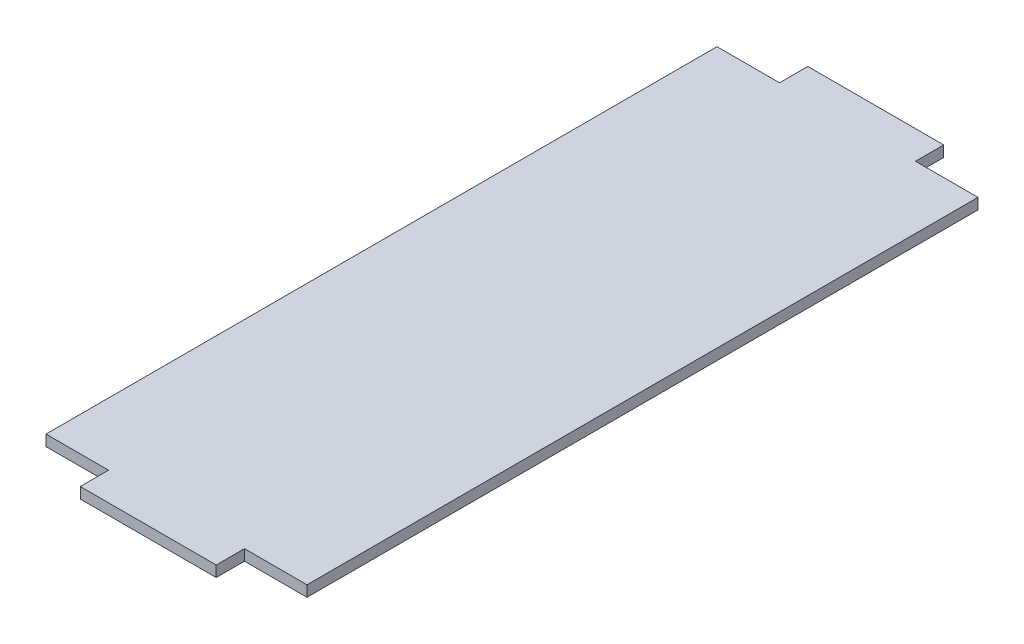
ISO-10303-21;
HEADER;
FILE_DESCRIPTION(('STEP AP214'),'2;1');
FILE_NAME('part.step','',(''),(''),'','','');
FILE_SCHEMA(('AUTOMOTIVE_DESIGN { 1 0 10303 214 1 1 1 1 }'));
ENDSEC;
DATA;
#1=APPLICATION_CONTEXT('core data for automotive mechanical design processes');
#2=APPLICATION_PROTOCOL_DEFINITION('international standard','automotive_design',2000,#1);
#3=PRODUCT_CONTEXT('',#1,'mechanical');
#4=PRODUCT('Part','Part','',(#3));
#5=PRODUCT_RELATED_PRODUCT_CATEGORY('part','',(#4));
#6=PRODUCT_DEFINITION_FORMATION('','',#4);
#7=PRODUCT_DEFINITION_CONTEXT('part definition',#1,'design');
#8=PRODUCT_DEFINITION('design','',#6,#7);
#9=PRODUCT_DEFINITION_SHAPE('','',#8);
#10=(LENGTH_UNIT() NAMED_UNIT(*) SI_UNIT(.MILLI.,.METRE.));
#11=(NAMED_UNIT(*) PLANE_ANGLE_UNIT() SI_UNIT($,.RADIAN.));
#12=(NAMED_UNIT(*) SI_UNIT($,.STERADIAN.) SOLID_ANGLE_UNIT());
#13=UNCERTAINTY_MEASURE_WITH_UNIT(LENGTH_MEASURE(1.E-05),#10,'distance_accuracy_value','');
#14=(GEOMETRIC_REPRESENTATION_CONTEXT(3) GLOBAL_UNCERTAINTY_ASSIGNED_CONTEXT((#13)) GLOBAL_UNIT_ASSIGNED_CONTEXT((#10,
#11,#12)) REPRESENTATION_CONTEXT('',''));
#15=CARTESIAN_POINT('',(0.,0.,0.));
#16=DIRECTION('',(0.,0.,1.));
#17=DIRECTION('',(1.,0.,0.));
#18=AXIS2_PLACEMENT_3D('',#15,#16,#17);
#19=CARTESIAN_POINT('',(0.,0.,0.));
#20=DIRECTION('',(0.,1.,0.));
#21=DIRECTION('',(0.,0.,1.));
#22=AXIS2_PLACEMENT_3D('',#19,#20,#21);
#23=PLANE('',#22);
#24=DIRECTION('',(0.,0.,-1.));
#25=VECTOR('',#24,1.);
#26=CARTESIAN_POINT('',(0.625,0.,3.215));
#27=LINE('',#26,#25);
#28=CARTESIAN_POINT('',(0.625,0.,3.345));
#29=VERTEX_POINT('',#28);
#30=CARTESIAN_POINT('',(0.625,0.,3.085));
#31=VERTEX_POINT('',#30);
#32=EDGE_CURVE('E119',#29,#31,#27,.T.);
#33=ORIENTED_EDGE('',*,*,#32,.F.);
#34=DIRECTION('',(1.,0.,0.));
#35=VECTOR('',#34,1.);
#36=CARTESIAN_POINT('',(0.,0.,3.345));
#37=LINE('',#36,#35);
#38=CARTESIAN_POINT('',(-0.625,0.,3.345));
#39=VERTEX_POINT('',#38);
#40=EDGE_CURVE('E118',#39,#29,#37,.T.);
#41=ORIENTED_EDGE('',*,*,#40,.F.);
#42=DIRECTION('',(0.,0.,1.));
#43=VECTOR('',#42,1.);
#44=CARTESIAN_POINT('',(-0.625,0.,0.));
#45=LINE('',#44,#43);
#46=CARTESIAN_POINT('',(-0.625,0.,3.085));
#47=VERTEX_POINT('',#46);
#48=EDGE_CURVE('E101',#47,#39,#45,.T.);
#49=ORIENTED_EDGE('',*,*,#48,.F.);
#50=DIRECTION('',(1.,0.,0.));
#51=VECTOR('',#50,1.);
#52=CARTESIAN_POINT('',(0.,0.,3.085));
#53=LINE('',#52,#51);
#54=CARTESIAN_POINT('',(-1.2,0.,3.085));
#55=VERTEX_POINT('',#54);
#56=EDGE_CURVE('E19',#55,#47,#53,.T.);
#57=ORIENTED_EDGE('',*,*,#56,.F.);
#58=DIRECTION('',(0.,0.,1.));
#59=VECTOR('',#58,1.);
#60=CARTESIAN_POINT('',(-1.2,0.,-1.5425));
#61=LINE('',#60,#59);
#62=CARTESIAN_POINT('',(-1.2,0.,-3.085));
#63=VERTEX_POINT('',#62);
#64=EDGE_CURVE('E166',#63,#55,#61,.T.);
#65=ORIENTED_EDGE('',*,*,#64,.F.);
#66=DIRECTION('',(-1.,0.,0.));
#67=VECTOR('',#66,1.);
#68=CARTESIAN_POINT('',(-0.9125,0.,-3.085));
#69=LINE('',#68,#67);
#70=CARTESIAN_POINT('',(-0.625,0.,-3.085));
#71=VERTEX_POINT('',#70);
#72=EDGE_CURVE('E160',#71,#63,#69,.T.);
#73=ORIENTED_EDGE('',*,*,#72,.F.);
#74=DIRECTION('',(0.,0.,1.));
#75=VECTOR('',#74,1.);
#76=CARTESIAN_POINT('',(-0.625,0.,-3.215));
#77=LINE('',#76,#75);
#78=CARTESIAN_POINT('',(-0.625,0.,-3.345));
#79=VERTEX_POINT('',#78);
#80=EDGE_CURVE('E154',#79,#71,#77,.T.);
#81=ORIENTED_EDGE('',*,*,#80,.F.);
#82=DIRECTION('',(-1.,0.,0.));
#83=VECTOR('',#82,1.);
#84=CARTESIAN_POINT('',(0.3125,0.,-3.345));
#85=LINE('',#84,#83);
#86=CARTESIAN_POINT('',(0.625,0.,-3.345));
#87=VERTEX_POINT('',#86);
#88=EDGE_CURVE('E148',#87,#79,#85,.T.);
#89=ORIENTED_EDGE('',*,*,#88,.F.);
#90=DIRECTION('',(0.,0.,-1.));
#91=VECTOR('',#90,1.);
#92=CARTESIAN_POINT('',(0.625,0.,-3.215));
#93=LINE('',#92,#91);
#94=CARTESIAN_POINT('',(0.625,0.,-3.085));
#95=VERTEX_POINT('',#94);
#96=EDGE_CURVE('E142',#95,#87,#93,.T.);
#97=ORIENTED_EDGE('',*,*,#96,.F.);
#98=DIRECTION('',(-1.,0.,0.));
#99=VECTOR('',#98,1.);
#100=CARTESIAN_POINT('',(0.9125,0.,-3.085));
#101=LINE('',#100,#99);
#102=CARTESIAN_POINT('',(1.2,0.,-3.085));
#103=VERTEX_POINT('',#102);
#104=EDGE_CURVE('E136',#103,#95,#101,.T.);
#105=ORIENTED_EDGE('',*,*,#104,.F.);
#106=DIRECTION('',(0.,0.,-1.));
#107=VECTOR('',#106,1.);
#108=CARTESIAN_POINT('',(1.2,0.,1.5425));
#109=LINE('',#108,#107);
#110=CARTESIAN_POINT('',(1.2,0.,3.085));
#111=VERTEX_POINT('',#110);
#112=EDGE_CURVE('E130',#111,#103,#109,.T.);
#113=ORIENTED_EDGE('',*,*,#112,.F.);
#114=DIRECTION('',(1.,0.,0.));
#115=VECTOR('',#114,1.);
#116=CARTESIAN_POINT('',(0.9125,0.,3.085));
#117=LINE('',#116,#115);
#118=EDGE_CURVE('E124',#31,#111,#117,.T.);
#119=ORIENTED_EDGE('',*,*,#118,.F.);
#120=EDGE_LOOP('',(#33,#41,#49,#57,#65,#73,#81,#89,#97,#105,#113,#119));
#121=FACE_BOUND('',#120,.T.);
#122=ADVANCED_FACE('F16',(#121),#23,.F.);
#123=CARTESIAN_POINT('',(0.625,0.,3.215));
#124=DIRECTION('',(1.,0.,0.));
#125=DIRECTION('',(0.,0.,-1.));
#126=AXIS2_PLACEMENT_3D('',#123,#124,#125);
#127=PLANE('',#126);
#128=DIRECTION('',(0.,0.,1.));
#129=VECTOR('',#128,1.);
#130=CARTESIAN_POINT('',(0.625,0.1,0.));
#131=LINE('',#130,#129);
#132=CARTESIAN_POINT('',(0.625,0.1,3.345));
#133=VERTEX_POINT('',#132);
#134=CARTESIAN_POINT('',(0.625,0.1,3.085));
#135=VERTEX_POINT('',#134);
#136=EDGE_CURVE('E175',#133,#135,#131,.F.);
#137=ORIENTED_EDGE('',*,*,#136,.F.);
#138=DIRECTION('',(0.,1.,0.));
#139=VECTOR('',#138,1.);
#140=CARTESIAN_POINT('',(0.625,0.,3.345));
#141=LINE('',#140,#139);
#142=EDGE_CURVE('E114',#29,#133,#141,.T.);
#143=ORIENTED_EDGE('',*,*,#142,.F.);
#144=ORIENTED_EDGE('',*,*,#32,.T.);
#145=DIRECTION('',(0.,1.,0.));
#146=VECTOR('',#145,1.);
#147=CARTESIAN_POINT('',(0.625,0.,3.085));
#148=LINE('',#147,#146);
#149=EDGE_CURVE('E127',#135,#31,#148,.F.);
#150=ORIENTED_EDGE('',*,*,#149,.F.);
#151=EDGE_LOOP('',(#137,#143,#144,#150));
#152=FACE_BOUND('',#151,.T.);
#153=ADVANCED_FACE('F231',(#152),#127,.T.);
#154=CARTESIAN_POINT('',(0.9125,0.,3.085));
#155=DIRECTION('',(0.,0.,1.));
#156=DIRECTION('',(1.,0.,0.));
#157=AXIS2_PLACEMENT_3D('',#154,#155,#156);
#158=PLANE('',#157);
#159=DIRECTION('',(1.,0.,0.));
#160=VECTOR('',#159,1.);
#161=CARTESIAN_POINT('',(0.,0.1,3.085));
#162=LINE('',#161,#160);
#163=CARTESIAN_POINT('',(1.2,0.1,3.085));
#164=VERTEX_POINT('',#163);
#165=EDGE_CURVE('E178',#135,#164,#162,.T.);
#166=ORIENTED_EDGE('',*,*,#165,.F.);
#167=ORIENTED_EDGE('',*,*,#149,.T.);
#168=ORIENTED_EDGE('',*,*,#118,.T.);
#169=DIRECTION('',(0.,1.,0.));
#170=VECTOR('',#169,1.);
#171=CARTESIAN_POINT('',(1.19999999999999,0.,3.085));
#172=LINE('',#171,#170);
#173=EDGE_CURVE('E133',#164,#111,#172,.F.);
#174=ORIENTED_EDGE('',*,*,#173,.F.);
#175=EDGE_LOOP('',(#166,#167,#168,#174));
#176=FACE_BOUND('',#175,.T.);
#177=ADVANCED_FACE('F229',(#176),#158,.T.);
#178=CARTESIAN_POINT('',(1.2,0.,1.5425));
#179=DIRECTION('',(1.,0.,0.));
#180=DIRECTION('',(0.,0.,-1.));
#181=AXIS2_PLACEMENT_3D('',#178,#179,#180);
#182=PLANE('',#181);
#183=DIRECTION('',(0.,0.,1.));
#184=VECTOR('',#183,1.);
#185=CARTESIAN_POINT('',(1.2,0.1,0.));
#186=LINE('',#185,#184);
#187=CARTESIAN_POINT('',(1.20000000000001,0.1,-3.085));
#188=VERTEX_POINT('',#187);
#189=EDGE_CURVE('E181',#164,#188,#186,.F.);
#190=ORIENTED_EDGE('',*,*,#189,.F.);
#191=ORIENTED_EDGE('',*,*,#173,.T.);
#192=ORIENTED_EDGE('',*,*,#112,.T.);
#193=DIRECTION('',(0.,1.,0.));
#194=VECTOR('',#193,1.);
#195=CARTESIAN_POINT('',(1.2,0.,-3.085));
#196=LINE('',#195,#194);
#197=EDGE_CURVE('E139',#188,#103,#196,.F.);
#198=ORIENTED_EDGE('',*,*,#197,.F.);
#199=EDGE_LOOP('',(#190,#191,#192,#198));
#200=FACE_BOUND('',#199,.T.);
#201=ADVANCED_FACE('F226',(#200),#182,.T.);
#202=CARTESIAN_POINT('',(0.9125,0.,-3.085));
#203=DIRECTION('',(0.,0.,-1.));
#204=DIRECTION('',(-1.,0.,0.));
#205=AXIS2_PLACEMENT_3D('',#202,#203,#204);
#206=PLANE('',#205);
#207=DIRECTION('',(1.,0.,0.));
#208=VECTOR('',#207,1.);
#209=CARTESIAN_POINT('',(0.,0.1,-3.085));
#210=LINE('',#209,#208);
#211=CARTESIAN_POINT('',(0.625,0.1,-3.085));
#212=VERTEX_POINT('',#211);
#213=EDGE_CURVE('E184',#188,#212,#210,.F.);
#214=ORIENTED_EDGE('',*,*,#213,.F.);
#215=ORIENTED_EDGE('',*,*,#197,.T.);
#216=ORIENTED_EDGE('',*,*,#104,.T.);
#217=DIRECTION('',(0.,1.,0.));
#218=VECTOR('',#217,1.);
#219=CARTESIAN_POINT('',(0.625,0.,-3.085));
#220=LINE('',#219,#218);
#221=EDGE_CURVE('E145',#212,#95,#220,.F.);
#222=ORIENTED_EDGE('',*,*,#221,.F.);
#223=EDGE_LOOP('',(#214,#215,#216,#222));
#224=FACE_BOUND('',#223,.T.);
#225=ADVANCED_FACE('F223',(#224),#206,.T.);
#226=CARTESIAN_POINT('',(0.625,0.,-3.215));
#227=DIRECTION('',(1.,0.,0.));
#228=DIRECTION('',(0.,0.,-1.));
#229=AXIS2_PLACEMENT_3D('',#226,#227,#228);
#230=PLANE('',#229);
#231=DIRECTION('',(0.,0.,1.));
#232=VECTOR('',#231,1.);
#233=CARTESIAN_POINT('',(0.625,0.1,0.));
#234=LINE('',#233,#232);
#235=CARTESIAN_POINT('',(0.625,0.1,-3.345));
#236=VERTEX_POINT('',#235);
#237=EDGE_CURVE('E187',#212,#236,#234,.F.);
#238=ORIENTED_EDGE('',*,*,#237,.F.);
#239=ORIENTED_EDGE('',*,*,#221,.T.);
#240=ORIENTED_EDGE('',*,*,#96,.T.);
#241=DIRECTION('',(0.,1.,0.));
#242=VECTOR('',#241,1.);
#243=CARTESIAN_POINT('',(0.625,0.,-3.345));
#244=LINE('',#243,#242);
#245=EDGE_CURVE('E151',#236,#87,#244,.F.);
#246=ORIENTED_EDGE('',*,*,#245,.F.);
#247=EDGE_LOOP('',(#238,#239,#240,#246));
#248=FACE_BOUND('',#247,.T.);
#249=ADVANCED_FACE('F220',(#248),#230,.T.);
#250=CARTESIAN_POINT('',(0.3125,0.,-3.345));
#251=DIRECTION('',(0.,0.,-1.));
#252=DIRECTION('',(-1.,0.,0.));
#253=AXIS2_PLACEMENT_3D('',#250,#251,#252);
#254=PLANE('',#253);
#255=DIRECTION('',(1.,0.,0.));
#256=VECTOR('',#255,1.);
#257=CARTESIAN_POINT('',(0.,0.1,-3.345));
#258=LINE('',#257,#256);
#259=CARTESIAN_POINT('',(-0.625,0.1,-3.345));
#260=VERTEX_POINT('',#259);
#261=EDGE_CURVE('E190',#236,#260,#258,.F.);
#262=ORIENTED_EDGE('',*,*,#261,.F.);
#263=ORIENTED_EDGE('',*,*,#245,.T.);
#264=ORIENTED_EDGE('',*,*,#88,.T.);
#265=DIRECTION('',(0.,1.,0.));
#266=VECTOR('',#265,1.);
#267=CARTESIAN_POINT('',(-0.625,0.,-3.345));
#268=LINE('',#267,#266);
#269=EDGE_CURVE('E157',#260,#79,#268,.F.);
#270=ORIENTED_EDGE('',*,*,#269,.F.);
#271=EDGE_LOOP('',(#262,#263,#264,#270));
#272=FACE_BOUND('',#271,.T.);
#273=ADVANCED_FACE('F217',(#272),#254,.T.);
#274=CARTESIAN_POINT('',(-0.625,0.,-3.215));
#275=DIRECTION('',(-1.,0.,0.));
#276=DIRECTION('',(0.,0.,1.));
#277=AXIS2_PLACEMENT_3D('',#274,#275,#276);
#278=PLANE('',#277);
#279=DIRECTION('',(0.,0.,1.));
#280=VECTOR('',#279,1.);
#281=CARTESIAN_POINT('',(-0.625,0.1,0.));
#282=LINE('',#281,#280);
#283=CARTESIAN_POINT('',(-0.625,0.1,-3.085));
#284=VERTEX_POINT('',#283);
#285=EDGE_CURVE('E193',#260,#284,#282,.T.);
#286=ORIENTED_EDGE('',*,*,#285,.F.);
#287=ORIENTED_EDGE('',*,*,#269,.T.);
#288=ORIENTED_EDGE('',*,*,#80,.T.);
#289=DIRECTION('',(0.,1.,0.));
#290=VECTOR('',#289,1.);
#291=CARTESIAN_POINT('',(-0.625,0.,-3.085));
#292=LINE('',#291,#290);
#293=EDGE_CURVE('E163',#284,#71,#292,.F.);
#294=ORIENTED_EDGE('',*,*,#293,.F.);
#295=EDGE_LOOP('',(#286,#287,#288,#294));
#296=FACE_BOUND('',#295,.T.);
#297=ADVANCED_FACE('F214',(#296),#278,.T.);
#298=CARTESIAN_POINT('',(-0.9125,0.,-3.085));
#299=DIRECTION('',(0.,0.,-1.));
#300=DIRECTION('',(-1.,0.,0.));
#301=AXIS2_PLACEMENT_3D('',#298,#299,#300);
#302=PLANE('',#301);
#303=DIRECTION('',(1.,0.,0.));
#304=VECTOR('',#303,1.);
#305=CARTESIAN_POINT('',(0.,0.1,-3.085));
#306=LINE('',#305,#304);
#307=CARTESIAN_POINT('',(-1.2,0.1,-3.085));
#308=VERTEX_POINT('',#307);
#309=EDGE_CURVE('E196',#284,#308,#306,.F.);
#310=ORIENTED_EDGE('',*,*,#309,.F.);
#311=ORIENTED_EDGE('',*,*,#293,.T.);
#312=ORIENTED_EDGE('',*,*,#72,.T.);
#313=DIRECTION('',(0.,1.,0.));
#314=VECTOR('',#313,1.);
#315=CARTESIAN_POINT('',(-1.19999999999999,0.,-3.085));
#316=LINE('',#315,#314);
#317=EDGE_CURVE('E168',#308,#63,#316,.F.);
#318=ORIENTED_EDGE('',*,*,#317,.F.);
#319=EDGE_LOOP('',(#310,#311,#312,#318));
#320=FACE_BOUND('',#319,.T.);
#321=ADVANCED_FACE('F211',(#320),#302,.T.);
#322=CARTESIAN_POINT('',(-1.2,0.,-1.5425));
#323=DIRECTION('',(-1.,0.,0.));
#324=DIRECTION('',(0.,0.,1.));
#325=AXIS2_PLACEMENT_3D('',#322,#323,#324);
#326=PLANE('',#325);
#327=DIRECTION('',(0.,0.,1.));
#328=VECTOR('',#327,1.);
#329=CARTESIAN_POINT('',(-1.2,0.1,0.));
#330=LINE('',#329,#328);
#331=CARTESIAN_POINT('',(-1.20000000000001,0.1,3.085));
#332=VERTEX_POINT('',#331);
#333=EDGE_CURVE('E199',#308,#332,#330,.T.);
#334=ORIENTED_EDGE('',*,*,#333,.F.);
#335=ORIENTED_EDGE('',*,*,#317,.T.);
#336=ORIENTED_EDGE('',*,*,#64,.T.);
#337=DIRECTION('',(0.,1.,0.));
#338=VECTOR('',#337,1.);
#339=CARTESIAN_POINT('',(-1.2,0.,3.085));
#340=LINE('',#339,#338);
#341=EDGE_CURVE('E108',#332,#55,#340,.F.);
#342=ORIENTED_EDGE('',*,*,#341,.F.);
#343=EDGE_LOOP('',(#334,#335,#336,#342));
#344=FACE_BOUND('',#343,.T.);
#345=ADVANCED_FACE('F209',(#344),#326,.T.);
#346=CARTESIAN_POINT('',(-0.9125,0.,3.085));
#347=DIRECTION('',(0.,0.,1.));
#348=DIRECTION('',(1.,0.,0.));
#349=AXIS2_PLACEMENT_3D('',#346,#347,#348);
#350=PLANE('',#349);
#351=DIRECTION('',(1.,0.,0.));
#352=VECTOR('',#351,1.);
#353=CARTESIAN_POINT('',(0.,0.1,3.085));
#354=LINE('',#353,#352);
#355=CARTESIAN_POINT('',(-0.625,0.1,3.085));
#356=VERTEX_POINT('',#355);
#357=EDGE_CURVE('E202',#332,#356,#354,.T.);
#358=ORIENTED_EDGE('',*,*,#357,.F.);
#359=ORIENTED_EDGE('',*,*,#341,.T.);
#360=ORIENTED_EDGE('',*,*,#56,.T.);
#361=DIRECTION('',(0.,1.,0.));
#362=VECTOR('',#361,1.);
#363=CARTESIAN_POINT('',(-0.625,0.,3.085));
#364=LINE('',#363,#362);
#365=EDGE_CURVE('E107',#356,#47,#364,.F.);
#366=ORIENTED_EDGE('',*,*,#365,.F.);
#367=EDGE_LOOP('',(#358,#359,#360,#366));
#368=FACE_BOUND('',#367,.T.);
#369=ADVANCED_FACE('F106',(#368),#350,.T.);
#370=CARTESIAN_POINT('',(-0.625,0.,3.215));
#371=DIRECTION('',(-1.,0.,0.));
#372=DIRECTION('',(0.,0.,1.));
#373=AXIS2_PLACEMENT_3D('',#370,#371,#372);
#374=PLANE('',#373);
#375=DIRECTION('',(0.,0.,1.));
#376=VECTOR('',#375,1.);
#377=CARTESIAN_POINT('',(-0.625,0.1,0.));
#378=LINE('',#377,#376);
#379=CARTESIAN_POINT('',(-0.625,0.1,3.345));
#380=VERTEX_POINT('',#379);
#381=EDGE_CURVE('E25',#356,#380,#378,.T.);
#382=ORIENTED_EDGE('',*,*,#381,.F.);
#383=ORIENTED_EDGE('',*,*,#365,.T.);
#384=ORIENTED_EDGE('',*,*,#48,.T.);
#385=DIRECTION('',(0.,1.,0.));
#386=VECTOR('',#385,1.);
#387=CARTESIAN_POINT('',(-0.625,0.,3.345));
#388=LINE('',#387,#386);
#389=EDGE_CURVE('E34',#380,#39,#388,.F.);
#390=ORIENTED_EDGE('',*,*,#389,.F.);
#391=EDGE_LOOP('',(#382,#383,#384,#390));
#392=FACE_BOUND('',#391,.T.);
#393=ADVANCED_FACE('F111',(#392),#374,.T.);
#394=CARTESIAN_POINT('',(-0.3125,0.,3.345));
#395=DIRECTION('',(0.,0.,1.));
#396=DIRECTION('',(1.,0.,0.));
#397=AXIS2_PLACEMENT_3D('',#394,#395,#396);
#398=PLANE('',#397);
#399=DIRECTION('',(1.,0.,0.));
#400=VECTOR('',#399,1.);
#401=CARTESIAN_POINT('',(0.,0.1,3.345));
#402=LINE('',#401,#400);
#403=EDGE_CURVE('E10',#380,#133,#402,.T.);
#404=ORIENTED_EDGE('',*,*,#403,.F.);
#405=ORIENTED_EDGE('',*,*,#389,.T.);
#406=ORIENTED_EDGE('',*,*,#40,.T.);
#407=ORIENTED_EDGE('',*,*,#142,.T.);
#408=EDGE_LOOP('',(#404,#405,#406,#407));
#409=FACE_BOUND('',#408,.T.);
#410=ADVANCED_FACE('F234',(#409),#398,.T.);
#411=CARTESIAN_POINT('',(0.,0.1,0.));
#412=DIRECTION('',(0.,1.,0.));
#413=DIRECTION('',(0.,0.,1.));
#414=AXIS2_PLACEMENT_3D('',#411,#412,#413);
#415=PLANE('',#414);
#416=ORIENTED_EDGE('',*,*,#381,.T.);
#417=ORIENTED_EDGE('',*,*,#403,.T.);
#418=ORIENTED_EDGE('',*,*,#136,.T.);
#419=ORIENTED_EDGE('',*,*,#165,.T.);
#420=ORIENTED_EDGE('',*,*,#189,.T.);
#421=ORIENTED_EDGE('',*,*,#213,.T.);
#422=ORIENTED_EDGE('',*,*,#237,.T.);
#423=ORIENTED_EDGE('',*,*,#261,.T.);
#424=ORIENTED_EDGE('',*,*,#285,.T.);
#425=ORIENTED_EDGE('',*,*,#309,.T.);
#426=ORIENTED_EDGE('',*,*,#333,.T.);
#427=ORIENTED_EDGE('',*,*,#357,.T.);
#428=EDGE_LOOP('',(#416,#417,#418,#419,#420,#421,#422,#423,#424,#425,#426,#427));
#429=FACE_BOUND('',#428,.T.);
#430=ADVANCED_FACE('F205',(#429),#415,.T.);
#431=CLOSED_SHELL('',(#122,#153,#177,#201,#225,#249,#273,#297,#321,#345,#369,#393,#410,#430));
#432=MANIFOLD_SOLID_BREP('B1',#431);
#433=ADVANCED_BREP_SHAPE_REPRESENTATION('',(#18,#432),#14);
#434=SHAPE_DEFINITION_REPRESENTATION(#9,#433);
ENDSEC;
END-ISO-10303-21;
